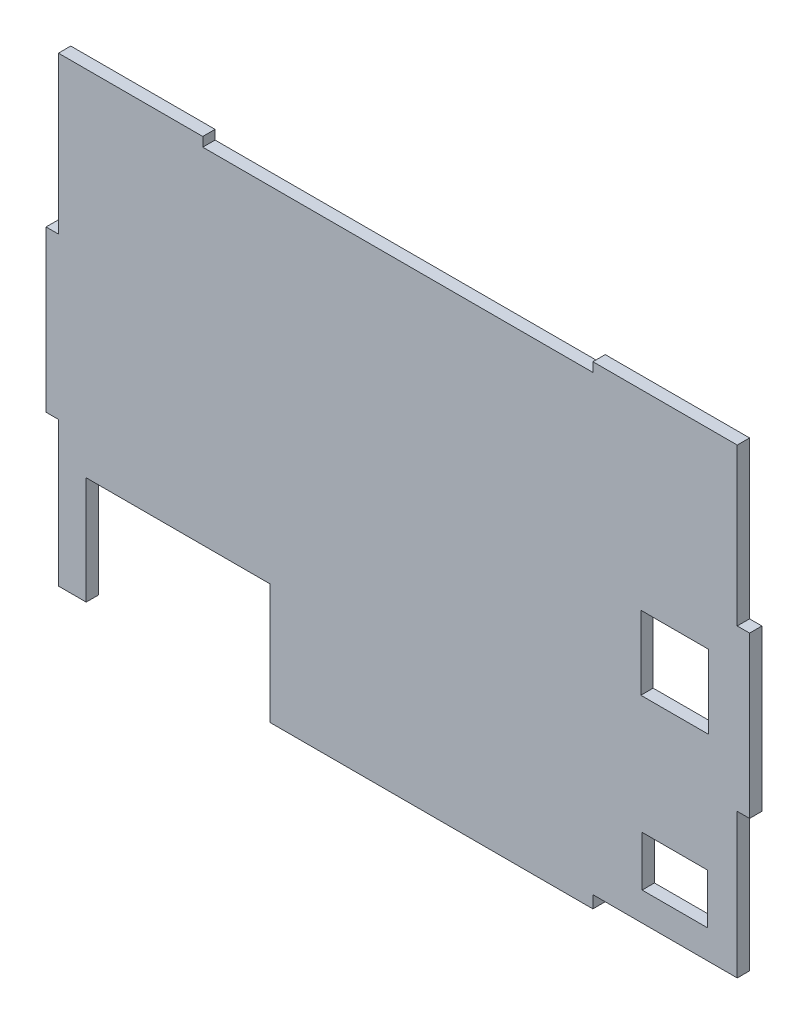
ISO-10303-21;
HEADER;
FILE_DESCRIPTION(('STEP AP214'),'2;1');
FILE_NAME('part.step','',(''),(''),'','','');
FILE_SCHEMA(('AUTOMOTIVE_DESIGN { 1 0 10303 214 1 1 1 1 }'));
ENDSEC;
DATA;
#1=APPLICATION_CONTEXT('core data for automotive mechanical design processes');
#2=APPLICATION_PROTOCOL_DEFINITION('international standard','automotive_design',2000,#1);
#3=PRODUCT_CONTEXT('',#1,'mechanical');
#4=PRODUCT('Part','Part','',(#3));
#5=PRODUCT_RELATED_PRODUCT_CATEGORY('part','',(#4));
#6=PRODUCT_DEFINITION_FORMATION('','',#4);
#7=PRODUCT_DEFINITION_CONTEXT('part definition',#1,'design');
#8=PRODUCT_DEFINITION('design','',#6,#7);
#9=PRODUCT_DEFINITION_SHAPE('','',#8);
#10=(LENGTH_UNIT() NAMED_UNIT(*) SI_UNIT(.MILLI.,.METRE.));
#11=(NAMED_UNIT(*) PLANE_ANGLE_UNIT() SI_UNIT($,.RADIAN.));
#12=(NAMED_UNIT(*) SI_UNIT($,.STERADIAN.) SOLID_ANGLE_UNIT());
#13=UNCERTAINTY_MEASURE_WITH_UNIT(LENGTH_MEASURE(1.E-05),#10,'distance_accuracy_value','');
#14=(GEOMETRIC_REPRESENTATION_CONTEXT(3) GLOBAL_UNCERTAINTY_ASSIGNED_CONTEXT((#13)) GLOBAL_UNIT_ASSIGNED_CONTEXT((#10,
#11,#12)) REPRESENTATION_CONTEXT('',''));
#15=CARTESIAN_POINT('',(0.,0.,0.));
#16=DIRECTION('',(0.,0.,1.));
#17=DIRECTION('',(1.,0.,0.));
#18=AXIS2_PLACEMENT_3D('',#15,#16,#17);
#19=CARTESIAN_POINT('',(0.,0.,2.));
#20=DIRECTION('',(0.,0.,-1.));
#21=DIRECTION('',(-1.,0.,0.));
#22=AXIS2_PLACEMENT_3D('',#19,#20,#21);
#23=PLANE('',#22);
#24=DIRECTION('',(0.,1.,0.));
#25=VECTOR('',#24,1.);
#26=CARTESIAN_POINT('',(53.5587458826356,5.97071067811866,2.));
#27=LINE('',#26,#25);
#28=CARTESIAN_POINT('',(53.5587458826356,-5.97071067811866,2.));
#29=VERTEX_POINT('',#28);
#30=CARTESIAN_POINT('',(53.5587458826356,5.97071067811866,2.));
#31=VERTEX_POINT('',#30);
#32=EDGE_CURVE('E270',#29,#31,#27,.T.);
#33=ORIENTED_EDGE('',*,*,#32,.F.);
#34=DIRECTION('',(1.,0.,0.));
#35=VECTOR('',#34,1.);
#36=CARTESIAN_POINT('',(53.5587458826356,-5.97071067811866,2.));
#37=LINE('',#36,#35);
#38=CARTESIAN_POINT('',(42.6173245263983,-5.97071067811866,2.));
#39=VERTEX_POINT('',#38);
#40=EDGE_CURVE('E278',#39,#29,#37,.T.);
#41=ORIENTED_EDGE('',*,*,#40,.F.);
#42=DIRECTION('',(0.,-1.,0.));
#43=VECTOR('',#42,1.);
#44=CARTESIAN_POINT('',(42.6173245263983,5.97071067811866,2.));
#45=LINE('',#44,#43);
#46=CARTESIAN_POINT('',(42.6173245263983,5.97071067811866,2.));
#47=VERTEX_POINT('',#46);
#48=EDGE_CURVE('E275',#47,#39,#45,.T.);
#49=ORIENTED_EDGE('',*,*,#48,.F.);
#50=DIRECTION('',(-1.,0.,0.));
#51=VECTOR('',#50,1.);
#52=CARTESIAN_POINT('',(53.5587458826356,5.97071067811866,2.));
#53=LINE('',#52,#51);
#54=EDGE_CURVE('E272',#31,#47,#53,.T.);
#55=ORIENTED_EDGE('',*,*,#54,.F.);
#56=EDGE_LOOP('',(#33,#41,#49,#55));
#57=FACE_BOUND('',#56,.T.);
#58=DIRECTION('',(0.,1.,0.));
#59=VECTOR('',#58,1.);
#60=CARTESIAN_POINT('',(58.2480352045169,35.465,2.));
#61=LINE('',#60,#59);
#62=CARTESIAN_POINT('',(58.2480352045169,11.5707106781186,2.));
#63=VERTEX_POINT('',#62);
#64=CARTESIAN_POINT('',(58.2480352045169,36.9707106781186,2.));
#65=VERTEX_POINT('',#64);
#66=EDGE_CURVE('E301',#63,#65,#61,.T.);
#67=ORIENTED_EDGE('',*,*,#66,.T.);
#68=DIRECTION('',(-1.,0.,0.));
#69=VECTOR('',#68,1.);
#70=CARTESIAN_POINT('',(34.8480352045169,36.9707106781186,2.));
#71=LINE('',#70,#69);
#72=CARTESIAN_POINT('',(34.8480352045169,36.9707106781186,2.));
#73=VERTEX_POINT('',#72);
#74=EDGE_CURVE('E304',#65,#73,#71,.T.);
#75=ORIENTED_EDGE('',*,*,#74,.T.);
#76=DIRECTION('',(0.,-1.,0.));
#77=VECTOR('',#76,1.);
#78=CARTESIAN_POINT('',(34.8480352045169,36.9707106781186,2.));
#79=LINE('',#78,#77);
#80=CARTESIAN_POINT('',(34.8480352045169,35.465,2.));
#81=VERTEX_POINT('',#80);
#82=EDGE_CURVE('E307',#73,#81,#79,.T.);
#83=ORIENTED_EDGE('',*,*,#82,.T.);
#84=DIRECTION('',(-1.,0.,0.));
#85=VECTOR('',#84,1.);
#86=CARTESIAN_POINT('',(-28.3979647954831,35.465,2.));
#87=LINE('',#86,#85);
#88=CARTESIAN_POINT('',(-28.3979647954831,35.465,2.));
#89=VERTEX_POINT('',#88);
#90=EDGE_CURVE('E309',#81,#89,#87,.T.);
#91=ORIENTED_EDGE('',*,*,#90,.T.);
#92=DIRECTION('',(0.,1.,0.));
#93=VECTOR('',#92,1.);
#94=CARTESIAN_POINT('',(-28.3979647954831,36.9707106781186,2.));
#95=LINE('',#94,#93);
#96=CARTESIAN_POINT('',(-28.3979647954831,36.9707106781186,2.));
#97=VERTEX_POINT('',#96);
#98=EDGE_CURVE('E311',#89,#97,#95,.T.);
#99=ORIENTED_EDGE('',*,*,#98,.T.);
#100=DIRECTION('',(-1.,0.,0.));
#101=VECTOR('',#100,1.);
#102=CARTESIAN_POINT('',(-51.7979647954831,36.9707106781186,2.));
#103=LINE('',#102,#101);
#104=CARTESIAN_POINT('',(-51.7979647954831,36.9707106781186,2.));
#105=VERTEX_POINT('',#104);
#106=EDGE_CURVE('E313',#97,#105,#103,.T.);
#107=ORIENTED_EDGE('',*,*,#106,.T.);
#108=DIRECTION('',(0.,-1.,0.));
#109=VECTOR('',#108,1.);
#110=CARTESIAN_POINT('',(-51.7979647954831,35.465,2.));
#111=LINE('',#110,#109);
#112=CARTESIAN_POINT('',(-51.7979647954831,11.5707106781186,2.));
#113=VERTEX_POINT('',#112);
#114=EDGE_CURVE('E315',#105,#113,#111,.T.);
#115=ORIENTED_EDGE('',*,*,#114,.T.);
#116=DIRECTION('',(-1.,0.,0.));
#117=VECTOR('',#116,1.);
#118=CARTESIAN_POINT('',(-53.7979647954831,11.5707106781186,2.));
#119=LINE('',#118,#117);
#120=CARTESIAN_POINT('',(-53.7979647954831,11.5707106781186,2.));
#121=VERTEX_POINT('',#120);
#122=EDGE_CURVE('E317',#113,#121,#119,.T.);
#123=ORIENTED_EDGE('',*,*,#122,.T.);
#124=DIRECTION('',(0.,-1.,0.));
#125=VECTOR('',#124,1.);
#126=CARTESIAN_POINT('',(-53.7979647954831,-14.4510146345626,2.));
#127=LINE('',#126,#125);
#128=CARTESIAN_POINT('',(-53.7979647954831,-14.4510146345626,2.));
#129=VERTEX_POINT('',#128);
#130=EDGE_CURVE('E319',#121,#129,#127,.T.);
#131=ORIENTED_EDGE('',*,*,#130,.T.);
#132=DIRECTION('',(1.,0.,0.));
#133=VECTOR('',#132,1.);
#134=CARTESIAN_POINT('',(-53.7979647954831,-14.4510146345626,2.));
#135=LINE('',#134,#133);
#136=CARTESIAN_POINT('',(-51.7979647954831,-14.4510146345626,2.));
#137=VERTEX_POINT('',#136);
#138=EDGE_CURVE('E321',#129,#137,#135,.T.);
#139=ORIENTED_EDGE('',*,*,#138,.T.);
#140=DIRECTION('',(0.,-1.,0.));
#141=VECTOR('',#140,1.);
#142=CARTESIAN_POINT('',(-51.7979647954831,-37.8510146345626,2.));
#143=LINE('',#142,#141);
#144=CARTESIAN_POINT('',(-51.7979647954831,-37.8510146345626,2.));
#145=VERTEX_POINT('',#144);
#146=EDGE_CURVE('E323',#137,#145,#143,.T.);
#147=ORIENTED_EDGE('',*,*,#146,.T.);
#148=DIRECTION('',(1.,0.,0.));
#149=VECTOR('',#148,1.);
#150=CARTESIAN_POINT('',(-51.7979647954831,-37.8510146345626,2.));
#151=LINE('',#150,#149);
#152=CARTESIAN_POINT('',(-47.2897752841135,-37.8510146345626,2.));
#153=VERTEX_POINT('',#152);
#154=EDGE_CURVE('E325',#145,#153,#151,.T.);
#155=ORIENTED_EDGE('',*,*,#154,.T.);
#156=DIRECTION('',(0.,1.,0.));
#157=VECTOR('',#156,1.);
#158=CARTESIAN_POINT('',(-47.2897752841135,-20.3946869713528,2.));
#159=LINE('',#158,#157);
#160=CARTESIAN_POINT('',(-47.2897752841135,-20.3946869713528,2.));
#161=VERTEX_POINT('',#160);
#162=EDGE_CURVE('E327',#153,#161,#159,.T.);
#163=ORIENTED_EDGE('',*,*,#162,.T.);
#164=DIRECTION('',(1.,0.,0.));
#165=VECTOR('',#164,1.);
#166=CARTESIAN_POINT('',(-17.530083786104,-20.3946869713528,2.));
#167=LINE('',#166,#165);
#168=CARTESIAN_POINT('',(-17.530083786104,-20.3946869713528,2.));
#169=VERTEX_POINT('',#168);
#170=EDGE_CURVE('E329',#161,#169,#167,.T.);
#171=ORIENTED_EDGE('',*,*,#170,.T.);
#172=DIRECTION('',(0.,-1.,0.));
#173=VECTOR('',#172,1.);
#174=CARTESIAN_POINT('',(-17.530083786104,-20.3946869713528,2.));
#175=LINE('',#174,#173);
#176=CARTESIAN_POINT('',(-17.530083786104,-39.8510146345626,2.));
#177=VERTEX_POINT('',#176);
#178=EDGE_CURVE('E331',#169,#177,#175,.T.);
#179=ORIENTED_EDGE('',*,*,#178,.T.);
#180=DIRECTION('',(1.,0.,0.));
#181=VECTOR('',#180,1.);
#182=CARTESIAN_POINT('',(-17.530083786104,-39.8510146345626,2.));
#183=LINE('',#182,#181);
#184=CARTESIAN_POINT('',(34.8480352045169,-39.8510146345626,2.));
#185=VERTEX_POINT('',#184);
#186=EDGE_CURVE('E333',#177,#185,#183,.T.);
#187=ORIENTED_EDGE('',*,*,#186,.T.);
#188=DIRECTION('',(0.,1.,0.));
#189=VECTOR('',#188,1.);
#190=CARTESIAN_POINT('',(34.8480352045169,-37.8510146345626,2.));
#191=LINE('',#190,#189);
#192=CARTESIAN_POINT('',(34.8480352045169,-37.8510146345626,2.));
#193=VERTEX_POINT('',#192);
#194=EDGE_CURVE('E335',#185,#193,#191,.T.);
#195=ORIENTED_EDGE('',*,*,#194,.T.);
#196=DIRECTION('',(1.,0.,0.));
#197=VECTOR('',#196,1.);
#198=CARTESIAN_POINT('',(34.8480352045169,-37.8510146345626,2.));
#199=LINE('',#198,#197);
#200=CARTESIAN_POINT('',(58.2480352045169,-37.8510146345626,2.));
#201=VERTEX_POINT('',#200);
#202=EDGE_CURVE('E337',#193,#201,#199,.T.);
#203=ORIENTED_EDGE('',*,*,#202,.T.);
#204=DIRECTION('',(0.,1.,0.));
#205=VECTOR('',#204,1.);
#206=CARTESIAN_POINT('',(58.2480352045169,-37.8510146345626,2.));
#207=LINE('',#206,#205);
#208=CARTESIAN_POINT('',(58.2480352045169,-14.4510146345626,2.));
#209=VERTEX_POINT('',#208);
#210=EDGE_CURVE('E339',#201,#209,#207,.T.);
#211=ORIENTED_EDGE('',*,*,#210,.T.);
#212=DIRECTION('',(1.,0.,0.));
#213=VECTOR('',#212,1.);
#214=CARTESIAN_POINT('',(58.2480352045169,-14.4510146345626,2.));
#215=LINE('',#214,#213);
#216=CARTESIAN_POINT('',(60.2480352045169,-14.4510146345626,2.));
#217=VERTEX_POINT('',#216);
#218=EDGE_CURVE('E341',#209,#217,#215,.T.);
#219=ORIENTED_EDGE('',*,*,#218,.T.);
#220=DIRECTION('',(0.,1.,0.));
#221=VECTOR('',#220,1.);
#222=CARTESIAN_POINT('',(60.2480352045169,-14.4510146345626,2.));
#223=LINE('',#222,#221);
#224=CARTESIAN_POINT('',(60.2480352045169,11.5707106781186,2.));
#225=VERTEX_POINT('',#224);
#226=EDGE_CURVE('E343',#217,#225,#223,.T.);
#227=ORIENTED_EDGE('',*,*,#226,.T.);
#228=DIRECTION('',(-1.,0.,0.));
#229=VECTOR('',#228,1.);
#230=CARTESIAN_POINT('',(58.2480352045169,11.5707106781186,2.));
#231=LINE('',#230,#229);
#232=EDGE_CURVE('E345',#225,#63,#231,.T.);
#233=ORIENTED_EDGE('',*,*,#232,.T.);
#234=EDGE_LOOP('',(#67,#75,#83,#91,#99,#107,#115,#123,#131,#139,#147,#155,#163,#171,#179,#187,
#195,#203,#211,#219,#227,#233));
#235=FACE_BOUND('',#234,.T.);
#236=DIRECTION('',(0.,1.,0.));
#237=VECTOR('',#236,1.);
#238=CARTESIAN_POINT('',(53.4215874649373,-25.1107463101761,2.));
#239=LINE('',#238,#237);
#240=CARTESIAN_POINT('',(53.4215874649373,-33.2154458520009,2.));
#241=VERTEX_POINT('',#240);
#242=CARTESIAN_POINT('',(53.4215874649373,-25.1107463101761,2.));
#243=VERTEX_POINT('',#242);
#244=EDGE_CURVE('E234',#241,#243,#239,.T.);
#245=ORIENTED_EDGE('',*,*,#244,.F.);
#246=DIRECTION('',(1.,0.,0.));
#247=VECTOR('',#246,1.);
#248=CARTESIAN_POINT('',(53.4215874649373,-33.2154458520009,2.));
#249=LINE('',#248,#247);
#250=CARTESIAN_POINT('',(42.8287810376808,-33.2154458520009,2.));
#251=VERTEX_POINT('',#250);
#252=EDGE_CURVE('E256',#251,#241,#249,.T.);
#253=ORIENTED_EDGE('',*,*,#252,.F.);
#254=DIRECTION('',(0.,-1.,0.));
#255=VECTOR('',#254,1.);
#256=CARTESIAN_POINT('',(42.8287810376808,-25.1107463101761,2.));
#257=LINE('',#256,#255);
#258=CARTESIAN_POINT('',(42.8287810376808,-25.1107463101761,2.));
#259=VERTEX_POINT('',#258);
#260=EDGE_CURVE('E254',#259,#251,#257,.T.);
#261=ORIENTED_EDGE('',*,*,#260,.F.);
#262=DIRECTION('',(-1.,0.,0.));
#263=VECTOR('',#262,1.);
#264=CARTESIAN_POINT('',(53.4215874649373,-25.1107463101761,2.));
#265=LINE('',#264,#263);
#266=EDGE_CURVE('E242',#243,#259,#265,.T.);
#267=ORIENTED_EDGE('',*,*,#266,.F.);
#268=EDGE_LOOP('',(#245,#253,#261,#267));
#269=FACE_BOUND('',#268,.T.);
#270=ADVANCED_FACE('F37',(#57,#235,#269),#23,.F.);
#271=CARTESIAN_POINT('',(0.,0.,0.));
#272=DIRECTION('',(0.,0.,-1.));
#273=DIRECTION('',(-1.,0.,0.));
#274=AXIS2_PLACEMENT_3D('',#271,#272,#273);
#275=PLANE('',#274);
#276=DIRECTION('',(-1.,0.,0.));
#277=VECTOR('',#276,1.);
#278=CARTESIAN_POINT('',(34.8480352045169,36.9707106781186,0.));
#279=LINE('',#278,#277);
#280=CARTESIAN_POINT('',(58.2480352045169,36.9707106781186,0.));
#281=VERTEX_POINT('',#280);
#282=CARTESIAN_POINT('',(34.8480352045169,36.9707106781186,0.));
#283=VERTEX_POINT('',#282);
#284=EDGE_CURVE('E300',#281,#283,#279,.T.);
#285=ORIENTED_EDGE('',*,*,#284,.F.);
#286=DIRECTION('',(0.,1.,0.));
#287=VECTOR('',#286,1.);
#288=CARTESIAN_POINT('',(58.2480352045169,11.5707106781186,0.));
#289=LINE('',#288,#287);
#290=CARTESIAN_POINT('',(58.2480352045169,11.5707106781186,0.));
#291=VERTEX_POINT('',#290);
#292=EDGE_CURVE('E305',#291,#281,#289,.T.);
#293=ORIENTED_EDGE('',*,*,#292,.F.);
#294=DIRECTION('',(-1.,0.,0.));
#295=VECTOR('',#294,1.);
#296=CARTESIAN_POINT('',(58.2480352045169,11.5707106781186,0.));
#297=LINE('',#296,#295);
#298=CARTESIAN_POINT('',(60.2480352045169,11.5707106781186,0.));
#299=VERTEX_POINT('',#298);
#300=EDGE_CURVE('E389',#299,#291,#297,.T.);
#301=ORIENTED_EDGE('',*,*,#300,.F.);
#302=DIRECTION('',(0.,1.,0.));
#303=VECTOR('',#302,1.);
#304=CARTESIAN_POINT('',(60.2480352045169,-14.4510146345626,0.));
#305=LINE('',#304,#303);
#306=CARTESIAN_POINT('',(60.2480352045169,-14.4510146345626,0.));
#307=VERTEX_POINT('',#306);
#308=EDGE_CURVE('E387',#307,#299,#305,.T.);
#309=ORIENTED_EDGE('',*,*,#308,.F.);
#310=DIRECTION('',(1.,0.,0.));
#311=VECTOR('',#310,1.);
#312=CARTESIAN_POINT('',(58.2480352045169,-14.4510146345626,0.));
#313=LINE('',#312,#311);
#314=CARTESIAN_POINT('',(58.2480352045169,-14.4510146345626,0.));
#315=VERTEX_POINT('',#314);
#316=EDGE_CURVE('E385',#315,#307,#313,.T.);
#317=ORIENTED_EDGE('',*,*,#316,.F.);
#318=DIRECTION('',(0.,1.,0.));
#319=VECTOR('',#318,1.);
#320=CARTESIAN_POINT('',(58.2480352045169,-37.8510146345626,0.));
#321=LINE('',#320,#319);
#322=CARTESIAN_POINT('',(58.2480352045169,-37.8510146345626,0.));
#323=VERTEX_POINT('',#322);
#324=EDGE_CURVE('E383',#323,#315,#321,.T.);
#325=ORIENTED_EDGE('',*,*,#324,.F.);
#326=DIRECTION('',(1.,0.,0.));
#327=VECTOR('',#326,1.);
#328=CARTESIAN_POINT('',(34.8480352045169,-37.8510146345626,0.));
#329=LINE('',#328,#327);
#330=CARTESIAN_POINT('',(34.8480352045169,-37.8510146345626,0.));
#331=VERTEX_POINT('',#330);
#332=EDGE_CURVE('E381',#331,#323,#329,.T.);
#333=ORIENTED_EDGE('',*,*,#332,.F.);
#334=DIRECTION('',(0.,1.,0.));
#335=VECTOR('',#334,1.);
#336=CARTESIAN_POINT('',(34.8480352045169,-37.8510146345626,0.));
#337=LINE('',#336,#335);
#338=CARTESIAN_POINT('',(34.8480352045169,-39.8510146345626,0.));
#339=VERTEX_POINT('',#338);
#340=EDGE_CURVE('E379',#339,#331,#337,.T.);
#341=ORIENTED_EDGE('',*,*,#340,.F.);
#342=DIRECTION('',(1.,0.,0.));
#343=VECTOR('',#342,1.);
#344=CARTESIAN_POINT('',(-17.530083786104,-39.8510146345626,0.));
#345=LINE('',#344,#343);
#346=CARTESIAN_POINT('',(-17.530083786104,-39.8510146345626,0.));
#347=VERTEX_POINT('',#346);
#348=EDGE_CURVE('E377',#347,#339,#345,.T.);
#349=ORIENTED_EDGE('',*,*,#348,.F.);
#350=DIRECTION('',(0.,-1.,0.));
#351=VECTOR('',#350,1.);
#352=CARTESIAN_POINT('',(-17.530083786104,-20.3946869713528,0.));
#353=LINE('',#352,#351);
#354=CARTESIAN_POINT('',(-17.530083786104,-20.3946869713528,0.));
#355=VERTEX_POINT('',#354);
#356=EDGE_CURVE('E375',#355,#347,#353,.T.);
#357=ORIENTED_EDGE('',*,*,#356,.F.);
#358=DIRECTION('',(1.,0.,0.));
#359=VECTOR('',#358,1.);
#360=CARTESIAN_POINT('',(-17.530083786104,-20.3946869713528,0.));
#361=LINE('',#360,#359);
#362=CARTESIAN_POINT('',(-47.2897752841135,-20.3946869713528,0.));
#363=VERTEX_POINT('',#362);
#364=EDGE_CURVE('E373',#363,#355,#361,.T.);
#365=ORIENTED_EDGE('',*,*,#364,.F.);
#366=DIRECTION('',(0.,1.,0.));
#367=VECTOR('',#366,1.);
#368=CARTESIAN_POINT('',(-47.2897752841135,-20.3946869713528,0.));
#369=LINE('',#368,#367);
#370=CARTESIAN_POINT('',(-47.2897752841135,-37.8510146345626,0.));
#371=VERTEX_POINT('',#370);
#372=EDGE_CURVE('E371',#371,#363,#369,.T.);
#373=ORIENTED_EDGE('',*,*,#372,.F.);
#374=DIRECTION('',(1.,0.,0.));
#375=VECTOR('',#374,1.);
#376=CARTESIAN_POINT('',(-51.7979647954831,-37.8510146345626,0.));
#377=LINE('',#376,#375);
#378=CARTESIAN_POINT('',(-51.7979647954831,-37.8510146345626,0.));
#379=VERTEX_POINT('',#378);
#380=EDGE_CURVE('E369',#379,#371,#377,.T.);
#381=ORIENTED_EDGE('',*,*,#380,.F.);
#382=DIRECTION('',(0.,-1.,0.));
#383=VECTOR('',#382,1.);
#384=CARTESIAN_POINT('',(-51.7979647954831,-37.8510146345626,0.));
#385=LINE('',#384,#383);
#386=CARTESIAN_POINT('',(-51.7979647954831,-14.4510146345626,0.));
#387=VERTEX_POINT('',#386);
#388=EDGE_CURVE('E367',#387,#379,#385,.T.);
#389=ORIENTED_EDGE('',*,*,#388,.F.);
#390=DIRECTION('',(1.,0.,0.));
#391=VECTOR('',#390,1.);
#392=CARTESIAN_POINT('',(-53.7979647954831,-14.4510146345626,0.));
#393=LINE('',#392,#391);
#394=CARTESIAN_POINT('',(-53.7979647954831,-14.4510146345626,0.));
#395=VERTEX_POINT('',#394);
#396=EDGE_CURVE('E365',#395,#387,#393,.T.);
#397=ORIENTED_EDGE('',*,*,#396,.F.);
#398=DIRECTION('',(0.,-1.,0.));
#399=VECTOR('',#398,1.);
#400=CARTESIAN_POINT('',(-53.7979647954831,-14.4510146345626,0.));
#401=LINE('',#400,#399);
#402=CARTESIAN_POINT('',(-53.7979647954831,11.5707106781186,0.));
#403=VERTEX_POINT('',#402);
#404=EDGE_CURVE('E363',#403,#395,#401,.T.);
#405=ORIENTED_EDGE('',*,*,#404,.F.);
#406=DIRECTION('',(-1.,0.,0.));
#407=VECTOR('',#406,1.);
#408=CARTESIAN_POINT('',(-53.7979647954831,11.5707106781186,0.));
#409=LINE('',#408,#407);
#410=CARTESIAN_POINT('',(-51.7979647954831,11.5707106781186,0.));
#411=VERTEX_POINT('',#410);
#412=EDGE_CURVE('E361',#411,#403,#409,.T.);
#413=ORIENTED_EDGE('',*,*,#412,.F.);
#414=DIRECTION('',(0.,-1.,0.));
#415=VECTOR('',#414,1.);
#416=CARTESIAN_POINT('',(-51.7979647954831,11.5707106781186,0.));
#417=LINE('',#416,#415);
#418=CARTESIAN_POINT('',(-51.7979647954831,36.9707106781186,0.));
#419=VERTEX_POINT('',#418);
#420=EDGE_CURVE('E359',#419,#411,#417,.T.);
#421=ORIENTED_EDGE('',*,*,#420,.F.);
#422=DIRECTION('',(-1.,0.,0.));
#423=VECTOR('',#422,1.);
#424=CARTESIAN_POINT('',(-51.7979647954831,36.9707106781186,0.));
#425=LINE('',#424,#423);
#426=CARTESIAN_POINT('',(-28.3979647954831,36.9707106781186,0.));
#427=VERTEX_POINT('',#426);
#428=EDGE_CURVE('E356',#427,#419,#425,.T.);
#429=ORIENTED_EDGE('',*,*,#428,.F.);
#430=DIRECTION('',(0.,1.,0.));
#431=VECTOR('',#430,1.);
#432=CARTESIAN_POINT('',(-28.3979647954831,36.9707106781186,0.));
#433=LINE('',#432,#431);
#434=CARTESIAN_POINT('',(-28.3979647954831,35.465,0.));
#435=VERTEX_POINT('',#434);
#436=EDGE_CURVE('E354',#435,#427,#433,.T.);
#437=ORIENTED_EDGE('',*,*,#436,.F.);
#438=DIRECTION('',(-1.,0.,0.));
#439=VECTOR('',#438,1.);
#440=CARTESIAN_POINT('',(-28.3979647954831,35.465,0.));
#441=LINE('',#440,#439);
#442=CARTESIAN_POINT('',(34.8480352045169,35.465,0.));
#443=VERTEX_POINT('',#442);
#444=EDGE_CURVE('E352',#443,#435,#441,.T.);
#445=ORIENTED_EDGE('',*,*,#444,.F.);
#446=DIRECTION('',(0.,-1.,0.));
#447=VECTOR('',#446,1.);
#448=CARTESIAN_POINT('',(34.8480352045169,36.9707106781186,0.));
#449=LINE('',#448,#447);
#450=EDGE_CURVE('E350',#283,#443,#449,.T.);
#451=ORIENTED_EDGE('',*,*,#450,.F.);
#452=EDGE_LOOP('',(#285,#293,#301,#309,#317,#325,#333,#341,#349,#357,#365,#373,#381,#389,#397,
#405,#413,#421,#429,#437,#445,#451));
#453=FACE_BOUND('',#452,.T.);
#454=DIRECTION('',(1.,0.,0.));
#455=VECTOR('',#454,1.);
#456=CARTESIAN_POINT('',(53.5587458826356,-5.97071067811866,0.));
#457=LINE('',#456,#455);
#458=CARTESIAN_POINT('',(42.6173245263983,-5.97071067811866,0.));
#459=VERTEX_POINT('',#458);
#460=CARTESIAN_POINT('',(53.5587458826356,-5.97071067811866,0.));
#461=VERTEX_POINT('',#460);
#462=EDGE_CURVE('E273',#459,#461,#457,.T.);
#463=ORIENTED_EDGE('',*,*,#462,.T.);
#464=DIRECTION('',(0.,1.,0.));
#465=VECTOR('',#464,1.);
#466=CARTESIAN_POINT('',(53.5587458826356,5.97071067811866,0.));
#467=LINE('',#466,#465);
#468=CARTESIAN_POINT('',(53.5587458826356,5.97071067811866,0.));
#469=VERTEX_POINT('',#468);
#470=EDGE_CURVE('E250',#461,#469,#467,.T.);
#471=ORIENTED_EDGE('',*,*,#470,.T.);
#472=DIRECTION('',(-1.,0.,0.));
#473=VECTOR('',#472,1.);
#474=CARTESIAN_POINT('',(53.5587458826356,5.97071067811866,0.));
#475=LINE('',#474,#473);
#476=CARTESIAN_POINT('',(42.6173245263983,5.97071067811866,0.));
#477=VERTEX_POINT('',#476);
#478=EDGE_CURVE('E283',#469,#477,#475,.T.);
#479=ORIENTED_EDGE('',*,*,#478,.T.);
#480=DIRECTION('',(0.,-1.,0.));
#481=VECTOR('',#480,1.);
#482=CARTESIAN_POINT('',(42.6173245263983,5.97071067811866,0.));
#483=LINE('',#482,#481);
#484=EDGE_CURVE('E286',#477,#459,#483,.T.);
#485=ORIENTED_EDGE('',*,*,#484,.T.);
#486=EDGE_LOOP('',(#463,#471,#479,#485));
#487=FACE_BOUND('',#486,.T.);
#488=DIRECTION('',(1.,0.,0.));
#489=VECTOR('',#488,1.);
#490=CARTESIAN_POINT('',(53.4215874649373,-33.2154458520009,0.));
#491=LINE('',#490,#489);
#492=CARTESIAN_POINT('',(42.8287810376808,-33.2154458520009,0.));
#493=VERTEX_POINT('',#492);
#494=CARTESIAN_POINT('',(53.4215874649373,-33.2154458520009,0.));
#495=VERTEX_POINT('',#494);
#496=EDGE_CURVE('E243',#493,#495,#491,.T.);
#497=ORIENTED_EDGE('',*,*,#496,.T.);
#498=DIRECTION('',(0.,1.,0.));
#499=VECTOR('',#498,1.);
#500=CARTESIAN_POINT('',(53.4215874649373,-25.1107463101761,0.));
#501=LINE('',#500,#499);
#502=CARTESIAN_POINT('',(53.4215874649373,-25.1107463101761,0.));
#503=VERTEX_POINT('',#502);
#504=EDGE_CURVE('E60',#495,#503,#501,.T.);
#505=ORIENTED_EDGE('',*,*,#504,.T.);
#506=DIRECTION('',(-1.,0.,0.));
#507=VECTOR('',#506,1.);
#508=CARTESIAN_POINT('',(53.4215874649373,-25.1107463101761,0.));
#509=LINE('',#508,#507);
#510=CARTESIAN_POINT('',(42.8287810376808,-25.1107463101761,0.));
#511=VERTEX_POINT('',#510);
#512=EDGE_CURVE('E249',#503,#511,#509,.T.);
#513=ORIENTED_EDGE('',*,*,#512,.T.);
#514=DIRECTION('',(0.,-1.,0.));
#515=VECTOR('',#514,1.);
#516=CARTESIAN_POINT('',(42.8287810376808,-25.1107463101761,0.));
#517=LINE('',#516,#515);
#518=EDGE_CURVE('E262',#511,#493,#517,.T.);
#519=ORIENTED_EDGE('',*,*,#518,.T.);
#520=EDGE_LOOP('',(#497,#505,#513,#519));
#521=FACE_BOUND('',#520,.T.);
#522=ADVANCED_FACE('F461',(#453,#487,#521),#275,.T.);
#523=CARTESIAN_POINT('',(34.8480352045169,36.9707106781186,2.));
#524=DIRECTION('',(0.,-1.,0.));
#525=DIRECTION('',(0.,0.,-1.));
#526=AXIS2_PLACEMENT_3D('',#523,#524,#525);
#527=PLANE('',#526);
#528=ORIENTED_EDGE('',*,*,#284,.T.);
#529=DIRECTION('',(0.,0.,-1.));
#530=VECTOR('',#529,1.);
#531=CARTESIAN_POINT('',(34.8480352045169,36.9707106781186,2.));
#532=LINE('',#531,#530);
#533=EDGE_CURVE('E45',#73,#283,#532,.T.);
#534=ORIENTED_EDGE('',*,*,#533,.F.);
#535=ORIENTED_EDGE('',*,*,#74,.F.);
#536=DIRECTION('',(0.,0.,-1.));
#537=VECTOR('',#536,1.);
#538=CARTESIAN_POINT('',(58.2480352045169,36.9707106781186,2.));
#539=LINE('',#538,#537);
#540=EDGE_CURVE('E11',#65,#281,#539,.T.);
#541=ORIENTED_EDGE('',*,*,#540,.T.);
#542=EDGE_LOOP('',(#528,#534,#535,#541));
#543=FACE_BOUND('',#542,.T.);
#544=ADVANCED_FACE('F39',(#543),#527,.F.);
#545=CARTESIAN_POINT('',(34.8480352045169,36.9707106781186,2.));
#546=DIRECTION('',(1.,0.,0.));
#547=DIRECTION('',(0.,0.,-1.));
#548=AXIS2_PLACEMENT_3D('',#545,#546,#547);
#549=PLANE('',#548);
#550=ORIENTED_EDGE('',*,*,#450,.T.);
#551=DIRECTION('',(0.,0.,-1.));
#552=VECTOR('',#551,1.);
#553=CARTESIAN_POINT('',(34.8480352045169,35.465,2.));
#554=LINE('',#553,#552);
#555=EDGE_CURVE('E448',#81,#443,#554,.T.);
#556=ORIENTED_EDGE('',*,*,#555,.F.);
#557=ORIENTED_EDGE('',*,*,#82,.F.);
#558=ORIENTED_EDGE('',*,*,#533,.T.);
#559=EDGE_LOOP('',(#550,#556,#557,#558));
#560=FACE_BOUND('',#559,.T.);
#561=ADVANCED_FACE('F455',(#560),#549,.F.);
#562=CARTESIAN_POINT('',(-28.3979647954831,35.465,2.));
#563=DIRECTION('',(0.,-1.,0.));
#564=DIRECTION('',(0.,0.,-1.));
#565=AXIS2_PLACEMENT_3D('',#562,#563,#564);
#566=PLANE('',#565);
#567=ORIENTED_EDGE('',*,*,#444,.T.);
#568=DIRECTION('',(0.,0.,-1.));
#569=VECTOR('',#568,1.);
#570=CARTESIAN_POINT('',(-28.3979647954831,35.465,2.));
#571=LINE('',#570,#569);
#572=EDGE_CURVE('E445',#89,#435,#571,.T.);
#573=ORIENTED_EDGE('',*,*,#572,.F.);
#574=ORIENTED_EDGE('',*,*,#90,.F.);
#575=ORIENTED_EDGE('',*,*,#555,.T.);
#576=EDGE_LOOP('',(#567,#573,#574,#575));
#577=FACE_BOUND('',#576,.T.);
#578=ADVANCED_FACE('F468',(#577),#566,.F.);
#579=CARTESIAN_POINT('',(-28.3979647954831,36.9707106781186,2.));
#580=DIRECTION('',(-1.,0.,0.));
#581=DIRECTION('',(0.,0.,1.));
#582=AXIS2_PLACEMENT_3D('',#579,#580,#581);
#583=PLANE('',#582);
#584=ORIENTED_EDGE('',*,*,#436,.T.);
#585=DIRECTION('',(0.,0.,-1.));
#586=VECTOR('',#585,1.);
#587=CARTESIAN_POINT('',(-28.3979647954831,36.9707106781186,2.));
#588=LINE('',#587,#586);
#589=EDGE_CURVE('E442',#97,#427,#588,.T.);
#590=ORIENTED_EDGE('',*,*,#589,.F.);
#591=ORIENTED_EDGE('',*,*,#98,.F.);
#592=ORIENTED_EDGE('',*,*,#572,.T.);
#593=EDGE_LOOP('',(#584,#590,#591,#592));
#594=FACE_BOUND('',#593,.T.);
#595=ADVANCED_FACE('F472',(#594),#583,.F.);
#596=CARTESIAN_POINT('',(-51.7979647954831,36.9707106781186,2.));
#597=DIRECTION('',(0.,-1.,0.));
#598=DIRECTION('',(0.,0.,-1.));
#599=AXIS2_PLACEMENT_3D('',#596,#597,#598);
#600=PLANE('',#599);
#601=ORIENTED_EDGE('',*,*,#428,.T.);
#602=DIRECTION('',(0.,0.,-1.));
#603=VECTOR('',#602,1.);
#604=CARTESIAN_POINT('',(-51.7979647954831,36.9707106781186,2.));
#605=LINE('',#604,#603);
#606=EDGE_CURVE('E439',#105,#419,#605,.T.);
#607=ORIENTED_EDGE('',*,*,#606,.F.);
#608=ORIENTED_EDGE('',*,*,#106,.F.);
#609=ORIENTED_EDGE('',*,*,#589,.T.);
#610=EDGE_LOOP('',(#601,#607,#608,#609));
#611=FACE_BOUND('',#610,.T.);
#612=ADVANCED_FACE('F558',(#611),#600,.F.);
#613=CARTESIAN_POINT('',(-51.7979647954831,11.5707106781186,2.));
#614=DIRECTION('',(1.,0.,0.));
#615=DIRECTION('',(0.,0.,-1.));
#616=AXIS2_PLACEMENT_3D('',#613,#614,#615);
#617=PLANE('',#616);
#618=ORIENTED_EDGE('',*,*,#420,.T.);
#619=DIRECTION('',(0.,0.,-1.));
#620=VECTOR('',#619,1.);
#621=CARTESIAN_POINT('',(-51.7979647954831,11.5707106781186,2.));
#622=LINE('',#621,#620);
#623=EDGE_CURVE('E436',#113,#411,#622,.T.);
#624=ORIENTED_EDGE('',*,*,#623,.F.);
#625=ORIENTED_EDGE('',*,*,#114,.F.);
#626=ORIENTED_EDGE('',*,*,#606,.T.);
#627=EDGE_LOOP('',(#618,#624,#625,#626));
#628=FACE_BOUND('',#627,.T.);
#629=ADVANCED_FACE('F560',(#628),#617,.F.);
#630=CARTESIAN_POINT('',(-53.7979647954831,11.5707106781186,2.));
#631=DIRECTION('',(0.,-1.,0.));
#632=DIRECTION('',(0.,0.,-1.));
#633=AXIS2_PLACEMENT_3D('',#630,#631,#632);
#634=PLANE('',#633);
#635=ORIENTED_EDGE('',*,*,#412,.T.);
#636=DIRECTION('',(0.,0.,-1.));
#637=VECTOR('',#636,1.);
#638=CARTESIAN_POINT('',(-53.7979647954831,11.5707106781186,2.));
#639=LINE('',#638,#637);
#640=EDGE_CURVE('E433',#121,#403,#639,.T.);
#641=ORIENTED_EDGE('',*,*,#640,.F.);
#642=ORIENTED_EDGE('',*,*,#122,.F.);
#643=ORIENTED_EDGE('',*,*,#623,.T.);
#644=EDGE_LOOP('',(#635,#641,#642,#643));
#645=FACE_BOUND('',#644,.T.);
#646=ADVANCED_FACE('F554',(#645),#634,.F.);
#647=CARTESIAN_POINT('',(-53.7979647954831,-14.4510146345626,2.));
#648=DIRECTION('',(1.,0.,0.));
#649=DIRECTION('',(0.,0.,-1.));
#650=AXIS2_PLACEMENT_3D('',#647,#648,#649);
#651=PLANE('',#650);
#652=ORIENTED_EDGE('',*,*,#404,.T.);
#653=DIRECTION('',(0.,0.,-1.));
#654=VECTOR('',#653,1.);
#655=CARTESIAN_POINT('',(-53.7979647954831,-14.4510146345626,2.));
#656=LINE('',#655,#654);
#657=EDGE_CURVE('E430',#129,#395,#656,.T.);
#658=ORIENTED_EDGE('',*,*,#657,.F.);
#659=ORIENTED_EDGE('',*,*,#130,.F.);
#660=ORIENTED_EDGE('',*,*,#640,.T.);
#661=EDGE_LOOP('',(#652,#658,#659,#660));
#662=FACE_BOUND('',#661,.T.);
#663=ADVANCED_FACE('F550',(#662),#651,.F.);
#664=CARTESIAN_POINT('',(-53.7979647954831,-14.4510146345626,2.));
#665=DIRECTION('',(0.,1.,0.));
#666=DIRECTION('',(0.,0.,1.));
#667=AXIS2_PLACEMENT_3D('',#664,#665,#666);
#668=PLANE('',#667);
#669=ORIENTED_EDGE('',*,*,#396,.T.);
#670=DIRECTION('',(0.,0.,-1.));
#671=VECTOR('',#670,1.);
#672=CARTESIAN_POINT('',(-51.7979647954831,-14.4510146345626,2.));
#673=LINE('',#672,#671);
#674=EDGE_CURVE('E427',#137,#387,#673,.T.);
#675=ORIENTED_EDGE('',*,*,#674,.F.);
#676=ORIENTED_EDGE('',*,*,#138,.F.);
#677=ORIENTED_EDGE('',*,*,#657,.T.);
#678=EDGE_LOOP('',(#669,#675,#676,#677));
#679=FACE_BOUND('',#678,.T.);
#680=ADVANCED_FACE('F545',(#679),#668,.F.);
#681=CARTESIAN_POINT('',(-51.7979647954831,-37.8510146345626,2.));
#682=DIRECTION('',(1.,0.,0.));
#683=DIRECTION('',(0.,0.,-1.));
#684=AXIS2_PLACEMENT_3D('',#681,#682,#683);
#685=PLANE('',#684);
#686=ORIENTED_EDGE('',*,*,#388,.T.);
#687=DIRECTION('',(0.,0.,-1.));
#688=VECTOR('',#687,1.);
#689=CARTESIAN_POINT('',(-51.7979647954831,-37.8510146345626,2.));
#690=LINE('',#689,#688);
#691=EDGE_CURVE('E424',#145,#379,#690,.T.);
#692=ORIENTED_EDGE('',*,*,#691,.F.);
#693=ORIENTED_EDGE('',*,*,#146,.F.);
#694=ORIENTED_EDGE('',*,*,#674,.T.);
#695=EDGE_LOOP('',(#686,#692,#693,#694));
#696=FACE_BOUND('',#695,.T.);
#697=ADVANCED_FACE('F539',(#696),#685,.F.);
#698=CARTESIAN_POINT('',(-51.7979647954831,-37.8510146345626,2.));
#699=DIRECTION('',(0.,1.,0.));
#700=DIRECTION('',(0.,0.,1.));
#701=AXIS2_PLACEMENT_3D('',#698,#699,#700);
#702=PLANE('',#701);
#703=ORIENTED_EDGE('',*,*,#380,.T.);
#704=DIRECTION('',(0.,0.,-1.));
#705=VECTOR('',#704,1.);
#706=CARTESIAN_POINT('',(-47.2897752841135,-37.8510146345626,2.));
#707=LINE('',#706,#705);
#708=EDGE_CURVE('E421',#153,#371,#707,.T.);
#709=ORIENTED_EDGE('',*,*,#708,.F.);
#710=ORIENTED_EDGE('',*,*,#154,.F.);
#711=ORIENTED_EDGE('',*,*,#691,.T.);
#712=EDGE_LOOP('',(#703,#709,#710,#711));
#713=FACE_BOUND('',#712,.T.);
#714=ADVANCED_FACE('F535',(#713),#702,.F.);
#715=CARTESIAN_POINT('',(-47.2897752841135,-20.3946869713528,2.));
#716=DIRECTION('',(-1.,0.,0.));
#717=DIRECTION('',(0.,0.,1.));
#718=AXIS2_PLACEMENT_3D('',#715,#716,#717);
#719=PLANE('',#718);
#720=ORIENTED_EDGE('',*,*,#372,.T.);
#721=DIRECTION('',(0.,0.,-1.));
#722=VECTOR('',#721,1.);
#723=CARTESIAN_POINT('',(-47.2897752841135,-20.3946869713528,2.));
#724=LINE('',#723,#722);
#725=EDGE_CURVE('E418',#161,#363,#724,.T.);
#726=ORIENTED_EDGE('',*,*,#725,.F.);
#727=ORIENTED_EDGE('',*,*,#162,.F.);
#728=ORIENTED_EDGE('',*,*,#708,.T.);
#729=EDGE_LOOP('',(#720,#726,#727,#728));
#730=FACE_BOUND('',#729,.T.);
#731=ADVANCED_FACE('F530',(#730),#719,.F.);
#732=CARTESIAN_POINT('',(-17.530083786104,-20.3946869713528,2.));
#733=DIRECTION('',(0.,1.,0.));
#734=DIRECTION('',(-1.,0.,0.));
#735=AXIS2_PLACEMENT_3D('',#732,#733,#734);
#736=PLANE('',#735);
#737=ORIENTED_EDGE('',*,*,#364,.T.);
#738=DIRECTION('',(0.,0.,-1.));
#739=VECTOR('',#738,1.);
#740=CARTESIAN_POINT('',(-17.530083786104,-20.3946869713528,2.));
#741=LINE('',#740,#739);
#742=EDGE_CURVE('E415',#169,#355,#741,.T.);
#743=ORIENTED_EDGE('',*,*,#742,.F.);
#744=ORIENTED_EDGE('',*,*,#170,.F.);
#745=ORIENTED_EDGE('',*,*,#725,.T.);
#746=EDGE_LOOP('',(#737,#743,#744,#745));
#747=FACE_BOUND('',#746,.T.);
#748=ADVANCED_FACE('F524',(#747),#736,.F.);
#749=CARTESIAN_POINT('',(-17.530083786104,-20.3946869713528,2.));
#750=DIRECTION('',(1.,0.,0.));
#751=DIRECTION('',(0.,1.,0.));
#752=AXIS2_PLACEMENT_3D('',#749,#750,#751);
#753=PLANE('',#752);
#754=ORIENTED_EDGE('',*,*,#356,.T.);
#755=DIRECTION('',(0.,0.,-1.));
#756=VECTOR('',#755,1.);
#757=CARTESIAN_POINT('',(-17.530083786104,-39.8510146345626,2.));
#758=LINE('',#757,#756);
#759=EDGE_CURVE('E412',#177,#347,#758,.T.);
#760=ORIENTED_EDGE('',*,*,#759,.F.);
#761=ORIENTED_EDGE('',*,*,#178,.F.);
#762=ORIENTED_EDGE('',*,*,#742,.T.);
#763=EDGE_LOOP('',(#754,#760,#761,#762));
#764=FACE_BOUND('',#763,.T.);
#765=ADVANCED_FACE('F520',(#764),#753,.F.);
#766=CARTESIAN_POINT('',(-17.530083786104,-39.8510146345626,2.));
#767=DIRECTION('',(0.,1.,0.));
#768=DIRECTION('',(0.,0.,1.));
#769=AXIS2_PLACEMENT_3D('',#766,#767,#768);
#770=PLANE('',#769);
#771=ORIENTED_EDGE('',*,*,#348,.T.);
#772=DIRECTION('',(0.,0.,-1.));
#773=VECTOR('',#772,1.);
#774=CARTESIAN_POINT('',(34.8480352045169,-39.8510146345626,2.));
#775=LINE('',#774,#773);
#776=EDGE_CURVE('E409',#185,#339,#775,.T.);
#777=ORIENTED_EDGE('',*,*,#776,.F.);
#778=ORIENTED_EDGE('',*,*,#186,.F.);
#779=ORIENTED_EDGE('',*,*,#759,.T.);
#780=EDGE_LOOP('',(#771,#777,#778,#779));
#781=FACE_BOUND('',#780,.T.);
#782=ADVANCED_FACE('F515',(#781),#770,.F.);
#783=CARTESIAN_POINT('',(34.8480352045169,-37.8510146345626,2.));
#784=DIRECTION('',(-1.,0.,0.));
#785=DIRECTION('',(0.,0.,1.));
#786=AXIS2_PLACEMENT_3D('',#783,#784,#785);
#787=PLANE('',#786);
#788=ORIENTED_EDGE('',*,*,#340,.T.);
#789=DIRECTION('',(0.,0.,-1.));
#790=VECTOR('',#789,1.);
#791=CARTESIAN_POINT('',(34.8480352045169,-37.8510146345626,2.));
#792=LINE('',#791,#790);
#793=EDGE_CURVE('E406',#193,#331,#792,.T.);
#794=ORIENTED_EDGE('',*,*,#793,.F.);
#795=ORIENTED_EDGE('',*,*,#194,.F.);
#796=ORIENTED_EDGE('',*,*,#776,.T.);
#797=EDGE_LOOP('',(#788,#794,#795,#796));
#798=FACE_BOUND('',#797,.T.);
#799=ADVANCED_FACE('F509',(#798),#787,.F.);
#800=CARTESIAN_POINT('',(34.8480352045169,-37.8510146345626,2.));
#801=DIRECTION('',(0.,1.,0.));
#802=DIRECTION('',(0.,0.,1.));
#803=AXIS2_PLACEMENT_3D('',#800,#801,#802);
#804=PLANE('',#803);
#805=ORIENTED_EDGE('',*,*,#332,.T.);
#806=DIRECTION('',(0.,0.,-1.));
#807=VECTOR('',#806,1.);
#808=CARTESIAN_POINT('',(58.2480352045169,-37.8510146345626,2.));
#809=LINE('',#808,#807);
#810=EDGE_CURVE('E403',#201,#323,#809,.T.);
#811=ORIENTED_EDGE('',*,*,#810,.F.);
#812=ORIENTED_EDGE('',*,*,#202,.F.);
#813=ORIENTED_EDGE('',*,*,#793,.T.);
#814=EDGE_LOOP('',(#805,#811,#812,#813));
#815=FACE_BOUND('',#814,.T.);
#816=ADVANCED_FACE('F505',(#815),#804,.F.);
#817=CARTESIAN_POINT('',(58.2480352045169,-37.8510146345626,2.));
#818=DIRECTION('',(-1.,0.,0.));
#819=DIRECTION('',(0.,0.,1.));
#820=AXIS2_PLACEMENT_3D('',#817,#818,#819);
#821=PLANE('',#820);
#822=ORIENTED_EDGE('',*,*,#324,.T.);
#823=DIRECTION('',(0.,0.,-1.));
#824=VECTOR('',#823,1.);
#825=CARTESIAN_POINT('',(58.2480352045169,-14.4510146345626,2.));
#826=LINE('',#825,#824);
#827=EDGE_CURVE('E400',#209,#315,#826,.T.);
#828=ORIENTED_EDGE('',*,*,#827,.F.);
#829=ORIENTED_EDGE('',*,*,#210,.F.);
#830=ORIENTED_EDGE('',*,*,#810,.T.);
#831=EDGE_LOOP('',(#822,#828,#829,#830));
#832=FACE_BOUND('',#831,.T.);
#833=ADVANCED_FACE('F500',(#832),#821,.F.);
#834=CARTESIAN_POINT('',(58.2480352045169,-14.4510146345626,2.));
#835=DIRECTION('',(0.,1.,0.));
#836=DIRECTION('',(0.,0.,1.));
#837=AXIS2_PLACEMENT_3D('',#834,#835,#836);
#838=PLANE('',#837);
#839=ORIENTED_EDGE('',*,*,#316,.T.);
#840=DIRECTION('',(0.,0.,-1.));
#841=VECTOR('',#840,1.);
#842=CARTESIAN_POINT('',(60.2480352045169,-14.4510146345626,2.));
#843=LINE('',#842,#841);
#844=EDGE_CURVE('E397',#217,#307,#843,.T.);
#845=ORIENTED_EDGE('',*,*,#844,.F.);
#846=ORIENTED_EDGE('',*,*,#218,.F.);
#847=ORIENTED_EDGE('',*,*,#827,.T.);
#848=EDGE_LOOP('',(#839,#845,#846,#847));
#849=FACE_BOUND('',#848,.T.);
#850=ADVANCED_FACE('F494',(#849),#838,.F.);
#851=CARTESIAN_POINT('',(60.2480352045169,-14.4510146345626,2.));
#852=DIRECTION('',(-1.,0.,0.));
#853=DIRECTION('',(0.,0.,1.));
#854=AXIS2_PLACEMENT_3D('',#851,#852,#853);
#855=PLANE('',#854);
#856=ORIENTED_EDGE('',*,*,#308,.T.);
#857=DIRECTION('',(0.,0.,-1.));
#858=VECTOR('',#857,1.);
#859=CARTESIAN_POINT('',(60.2480352045169,11.5707106781186,2.));
#860=LINE('',#859,#858);
#861=EDGE_CURVE('E394',#225,#299,#860,.T.);
#862=ORIENTED_EDGE('',*,*,#861,.F.);
#863=ORIENTED_EDGE('',*,*,#226,.F.);
#864=ORIENTED_EDGE('',*,*,#844,.T.);
#865=EDGE_LOOP('',(#856,#862,#863,#864));
#866=FACE_BOUND('',#865,.T.);
#867=ADVANCED_FACE('F490',(#866),#855,.F.);
#868=CARTESIAN_POINT('',(58.2480352045169,11.5707106781186,2.));
#869=DIRECTION('',(0.,-1.,0.));
#870=DIRECTION('',(0.,0.,-1.));
#871=AXIS2_PLACEMENT_3D('',#868,#869,#870);
#872=PLANE('',#871);
#873=ORIENTED_EDGE('',*,*,#300,.T.);
#874=DIRECTION('',(0.,0.,-1.));
#875=VECTOR('',#874,1.);
#876=CARTESIAN_POINT('',(58.2480352045169,11.5707106781186,2.));
#877=LINE('',#876,#875);
#878=EDGE_CURVE('E348',#63,#291,#877,.T.);
#879=ORIENTED_EDGE('',*,*,#878,.F.);
#880=ORIENTED_EDGE('',*,*,#232,.F.);
#881=ORIENTED_EDGE('',*,*,#861,.T.);
#882=EDGE_LOOP('',(#873,#879,#880,#881));
#883=FACE_BOUND('',#882,.T.);
#884=ADVANCED_FACE('F485',(#883),#872,.F.);
#885=CARTESIAN_POINT('',(58.2480352045169,11.5707106781186,2.));
#886=DIRECTION('',(-1.,0.,0.));
#887=DIRECTION('',(0.,0.,1.));
#888=AXIS2_PLACEMENT_3D('',#885,#886,#887);
#889=PLANE('',#888);
#890=ORIENTED_EDGE('',*,*,#292,.T.);
#891=ORIENTED_EDGE('',*,*,#540,.F.);
#892=ORIENTED_EDGE('',*,*,#66,.F.);
#893=ORIENTED_EDGE('',*,*,#878,.T.);
#894=EDGE_LOOP('',(#890,#891,#892,#893));
#895=FACE_BOUND('',#894,.T.);
#896=ADVANCED_FACE('F479',(#895),#889,.F.);
#897=CARTESIAN_POINT('',(53.5587458826356,5.97071067811866,2.));
#898=DIRECTION('',(-1.,0.,0.));
#899=DIRECTION('',(0.,-1.,0.));
#900=AXIS2_PLACEMENT_3D('',#897,#898,#899);
#901=PLANE('',#900);
#902=ORIENTED_EDGE('',*,*,#470,.F.);
#903=DIRECTION('',(0.,0.,-1.));
#904=VECTOR('',#903,1.);
#905=CARTESIAN_POINT('',(53.5587458826356,-5.97071067811866,2.));
#906=LINE('',#905,#904);
#907=EDGE_CURVE('E280',#29,#461,#906,.T.);
#908=ORIENTED_EDGE('',*,*,#907,.F.);
#909=ORIENTED_EDGE('',*,*,#32,.T.);
#910=DIRECTION('',(0.,0.,-1.));
#911=VECTOR('',#910,1.);
#912=CARTESIAN_POINT('',(53.5587458826356,5.97071067811866,2.));
#913=LINE('',#912,#911);
#914=EDGE_CURVE('E297',#31,#469,#913,.T.);
#915=ORIENTED_EDGE('',*,*,#914,.T.);
#916=EDGE_LOOP('',(#902,#908,#909,#915));
#917=FACE_BOUND('',#916,.T.);
#918=ADVANCED_FACE('F578',(#917),#901,.T.);
#919=CARTESIAN_POINT('',(53.5587458826356,5.97071067811866,2.));
#920=DIRECTION('',(0.,-1.,0.));
#921=DIRECTION('',(0.,0.,-1.));
#922=AXIS2_PLACEMENT_3D('',#919,#920,#921);
#923=PLANE('',#922);
#924=ORIENTED_EDGE('',*,*,#478,.F.);
#925=ORIENTED_EDGE('',*,*,#914,.F.);
#926=ORIENTED_EDGE('',*,*,#54,.T.);
#927=DIRECTION('',(0.,0.,-1.));
#928=VECTOR('',#927,1.);
#929=CARTESIAN_POINT('',(42.6173245263983,5.97071067811866,2.));
#930=LINE('',#929,#928);
#931=EDGE_CURVE('E295',#47,#477,#930,.T.);
#932=ORIENTED_EDGE('',*,*,#931,.T.);
#933=EDGE_LOOP('',(#924,#925,#926,#932));
#934=FACE_BOUND('',#933,.T.);
#935=ADVANCED_FACE('F676',(#934),#923,.T.);
#936=CARTESIAN_POINT('',(42.6173245263983,5.97071067811866,2.));
#937=DIRECTION('',(1.,0.,0.));
#938=DIRECTION('',(0.,0.,-1.));
#939=AXIS2_PLACEMENT_3D('',#936,#937,#938);
#940=PLANE('',#939);
#941=ORIENTED_EDGE('',*,*,#484,.F.);
#942=ORIENTED_EDGE('',*,*,#931,.F.);
#943=ORIENTED_EDGE('',*,*,#48,.T.);
#944=DIRECTION('',(0.,0.,-1.));
#945=VECTOR('',#944,1.);
#946=CARTESIAN_POINT('',(42.6173245263983,-5.97071067811866,2.));
#947=LINE('',#946,#945);
#948=EDGE_CURVE('E293',#39,#459,#947,.T.);
#949=ORIENTED_EDGE('',*,*,#948,.T.);
#950=EDGE_LOOP('',(#941,#942,#943,#949));
#951=FACE_BOUND('',#950,.T.);
#952=ADVANCED_FACE('F683',(#951),#940,.T.);
#953=CARTESIAN_POINT('',(53.5587458826356,-5.97071067811866,2.));
#954=DIRECTION('',(0.,1.,0.));
#955=DIRECTION('',(0.,0.,1.));
#956=AXIS2_PLACEMENT_3D('',#953,#954,#955);
#957=PLANE('',#956);
#958=ORIENTED_EDGE('',*,*,#462,.F.);
#959=ORIENTED_EDGE('',*,*,#948,.F.);
#960=ORIENTED_EDGE('',*,*,#40,.T.);
#961=ORIENTED_EDGE('',*,*,#907,.T.);
#962=EDGE_LOOP('',(#958,#959,#960,#961));
#963=FACE_BOUND('',#962,.T.);
#964=ADVANCED_FACE('F690',(#963),#957,.T.);
#965=CARTESIAN_POINT('',(53.4215874649373,-25.1107463101761,2.));
#966=DIRECTION('',(-1.,0.,0.));
#967=DIRECTION('',(0.,0.,1.));
#968=AXIS2_PLACEMENT_3D('',#965,#966,#967);
#969=PLANE('',#968);
#970=ORIENTED_EDGE('',*,*,#504,.F.);
#971=DIRECTION('',(0.,0.,-1.));
#972=VECTOR('',#971,1.);
#973=CARTESIAN_POINT('',(53.4215874649373,-33.2154458520009,2.));
#974=LINE('',#973,#972);
#975=EDGE_CURVE('E238',#241,#495,#974,.T.);
#976=ORIENTED_EDGE('',*,*,#975,.F.);
#977=ORIENTED_EDGE('',*,*,#244,.T.);
#978=DIRECTION('',(0.,0.,-1.));
#979=VECTOR('',#978,1.);
#980=CARTESIAN_POINT('',(53.4215874649373,-25.1107463101761,2.));
#981=LINE('',#980,#979);
#982=EDGE_CURVE('E237',#243,#503,#981,.T.);
#983=ORIENTED_EDGE('',*,*,#982,.T.);
#984=EDGE_LOOP('',(#970,#976,#977,#983));
#985=FACE_BOUND('',#984,.T.);
#986=ADVANCED_FACE('F236',(#985),#969,.T.);
#987=CARTESIAN_POINT('',(53.4215874649373,-25.1107463101761,2.));
#988=DIRECTION('',(0.,-1.,0.));
#989=DIRECTION('',(0.,0.,-1.));
#990=AXIS2_PLACEMENT_3D('',#987,#988,#989);
#991=PLANE('',#990);
#992=ORIENTED_EDGE('',*,*,#512,.F.);
#993=ORIENTED_EDGE('',*,*,#982,.F.);
#994=ORIENTED_EDGE('',*,*,#266,.T.);
#995=DIRECTION('',(0.,0.,-1.));
#996=VECTOR('',#995,1.);
#997=CARTESIAN_POINT('',(42.8287810376808,-25.1107463101761,2.));
#998=LINE('',#997,#996);
#999=EDGE_CURVE('E251',#259,#511,#998,.T.);
#1000=ORIENTED_EDGE('',*,*,#999,.T.);
#1001=EDGE_LOOP('',(#992,#993,#994,#1000));
#1002=FACE_BOUND('',#1001,.T.);
#1003=ADVANCED_FACE('F246',(#1002),#991,.T.);
#1004=CARTESIAN_POINT('',(42.8287810376808,-25.1107463101761,2.));
#1005=DIRECTION('',(1.,0.,0.));
#1006=DIRECTION('',(0.,0.,-1.));
#1007=AXIS2_PLACEMENT_3D('',#1004,#1005,#1006);
#1008=PLANE('',#1007);
#1009=ORIENTED_EDGE('',*,*,#518,.F.);
#1010=ORIENTED_EDGE('',*,*,#999,.F.);
#1011=ORIENTED_EDGE('',*,*,#260,.T.);
#1012=DIRECTION('',(0.,0.,-1.));
#1013=VECTOR('',#1012,1.);
#1014=CARTESIAN_POINT('',(42.8287810376808,-33.2154458520009,2.));
#1015=LINE('',#1014,#1013);
#1016=EDGE_CURVE('E52',#251,#493,#1015,.T.);
#1017=ORIENTED_EDGE('',*,*,#1016,.T.);
#1018=EDGE_LOOP('',(#1009,#1010,#1011,#1017));
#1019=FACE_BOUND('',#1018,.T.);
#1020=ADVANCED_FACE('F711',(#1019),#1008,.T.);
#1021=CARTESIAN_POINT('',(53.4215874649373,-33.2154458520009,2.));
#1022=DIRECTION('',(0.,1.,0.));
#1023=DIRECTION('',(0.,0.,1.));
#1024=AXIS2_PLACEMENT_3D('',#1021,#1022,#1023);
#1025=PLANE('',#1024);
#1026=ORIENTED_EDGE('',*,*,#496,.F.);
#1027=ORIENTED_EDGE('',*,*,#1016,.F.);
#1028=ORIENTED_EDGE('',*,*,#252,.T.);
#1029=ORIENTED_EDGE('',*,*,#975,.T.);
#1030=EDGE_LOOP('',(#1026,#1027,#1028,#1029));
#1031=FACE_BOUND('',#1030,.T.);
#1032=ADVANCED_FACE('F718',(#1031),#1025,.T.);
#1033=CLOSED_SHELL('',(#270,#522,#544,#561,#578,#595,#612,#629,#646,#663,#680,#697,#714,#731,
#748,#765,#782,#799,#816,#833,#850,#867,#884,#896,#918,#935,#952,#964,#986,#1003,#1020,#1032));
#1034=MANIFOLD_SOLID_BREP('B2',#1033);
#1035=ADVANCED_BREP_SHAPE_REPRESENTATION('',(#18,#1034),#14);
#1036=SHAPE_DEFINITION_REPRESENTATION(#9,#1035);
ENDSEC;
END-ISO-10303-21;
